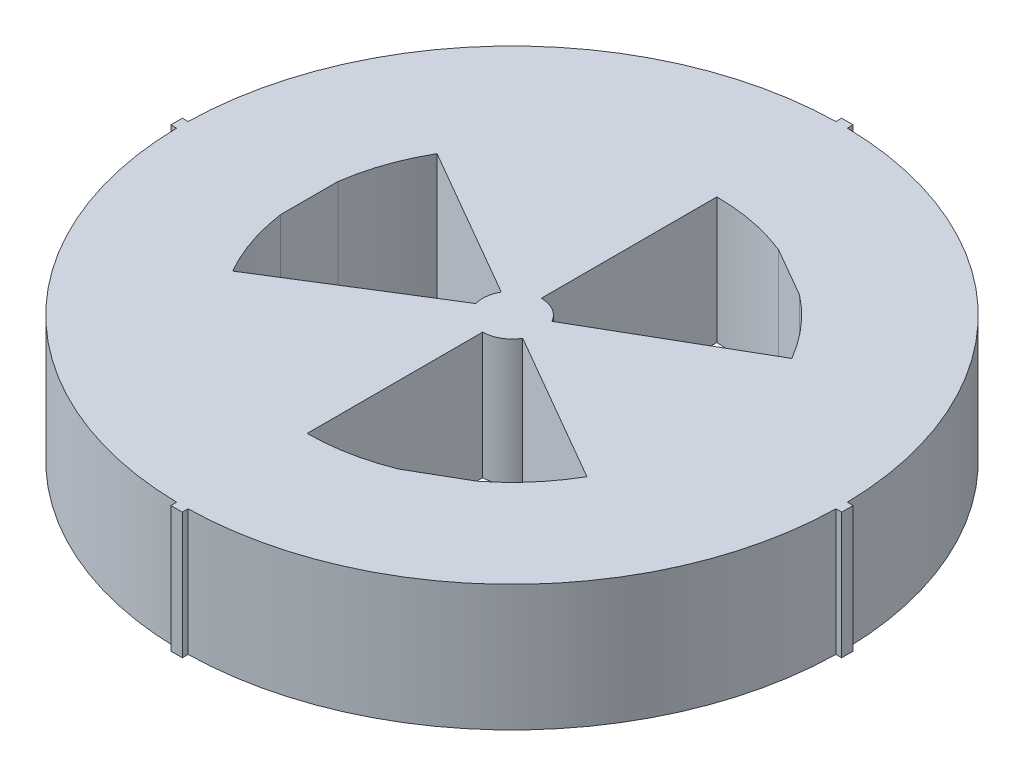
ISO-10303-21;
HEADER;
FILE_DESCRIPTION(('STEP AP214'),'2;1');
FILE_NAME('part.step','',(''),(''),'','','');
FILE_SCHEMA(('AUTOMOTIVE_DESIGN { 1 0 10303 214 1 1 1 1 }'));
ENDSEC;
DATA;
#1=APPLICATION_CONTEXT('core data for automotive mechanical design processes');
#2=APPLICATION_PROTOCOL_DEFINITION('international standard','automotive_design',2000,#1);
#3=PRODUCT_CONTEXT('',#1,'mechanical');
#4=PRODUCT('Part','Part','',(#3));
#5=PRODUCT_RELATED_PRODUCT_CATEGORY('part','',(#4));
#6=PRODUCT_DEFINITION_FORMATION('','',#4);
#7=PRODUCT_DEFINITION_CONTEXT('part definition',#1,'design');
#8=PRODUCT_DEFINITION('design','',#6,#7);
#9=PRODUCT_DEFINITION_SHAPE('','',#8);
#10=(LENGTH_UNIT() NAMED_UNIT(*) SI_UNIT(.MILLI.,.METRE.));
#11=(NAMED_UNIT(*) PLANE_ANGLE_UNIT() SI_UNIT($,.RADIAN.));
#12=(NAMED_UNIT(*) SI_UNIT($,.STERADIAN.) SOLID_ANGLE_UNIT());
#13=UNCERTAINTY_MEASURE_WITH_UNIT(LENGTH_MEASURE(1.E-05),#10,'distance_accuracy_value','');
#14=(GEOMETRIC_REPRESENTATION_CONTEXT(3) GLOBAL_UNCERTAINTY_ASSIGNED_CONTEXT((#13)) GLOBAL_UNIT_ASSIGNED_CONTEXT((#10,
#11,#12)) REPRESENTATION_CONTEXT('',''));
#15=CARTESIAN_POINT('',(0.,0.,0.));
#16=DIRECTION('',(0.,0.,1.));
#17=DIRECTION('',(1.,0.,0.));
#18=AXIS2_PLACEMENT_3D('',#15,#16,#17);
#19=CARTESIAN_POINT('',(0.,11.,0.));
#20=DIRECTION('',(0.,-1.,0.));
#21=DIRECTION('',(0.,0.,-1.));
#22=AXIS2_PLACEMENT_3D('',#19,#20,#21);
#23=PLANE('',#22);
#24=CARTESIAN_POINT('',(0.,11.,0.));
#25=DIRECTION('',(0.,-1.,0.));
#26=DIRECTION('',(0.,0.,-1.));
#27=AXIS2_PLACEMENT_3D('',#24,#25,#26);
#28=CIRCLE('',#27,2.55332923776841);
#29=CARTESIAN_POINT('',(2.21124798413299,11.,1.27666461888423));
#30=VERTEX_POINT('',#29);
#31=CARTESIAN_POINT('',(0.,11.,2.55332923776841));
#32=VERTEX_POINT('',#31);
#33=EDGE_CURVE('E292',#30,#32,#28,.T.);
#34=ORIENTED_EDGE('',*,*,#33,.F.);
#35=DIRECTION('',(0.866025403784433,0.,0.50000000000001));
#36=VECTOR('',#35,1.);
#37=CARTESIAN_POINT('',(0.,11.,0.));
#38=LINE('',#37,#36);
#39=CARTESIAN_POINT('',(15.4681544387612,11.,8.93054312908572));
#40=VERTEX_POINT('',#39);
#41=EDGE_CURVE('E303',#30,#40,#38,.T.);
#42=ORIENTED_EDGE('',*,*,#41,.T.);
#43=CARTESIAN_POINT('',(0.,11.,0.));
#44=DIRECTION('',(0.,-1.,0.));
#45=DIRECTION('',(0.,0.,-1.));
#46=AXIS2_PLACEMENT_3D('',#43,#44,#45);
#47=CIRCLE('',#46,17.8610862581711);
#48=CARTESIAN_POINT('',(11.008336836107,11.,14.0653802801289));
#49=VERTEX_POINT('',#48);
#50=EDGE_CURVE('E91',#40,#49,#47,.T.);
#51=ORIENTED_EDGE('',*,*,#50,.T.);
#52=DIRECTION('',(-0.866025403784442,0.,0.499999999999995));
#53=VECTOR('',#52,1.);
#54=CARTESIAN_POINT('',(8.84257252726679,11.,15.315784886839));
#55=LINE('',#54,#53);
#56=CARTESIAN_POINT('',(6.67680821842659,11.,16.5661894935492));
#57=VERTEX_POINT('',#56);
#58=EDGE_CURVE('E318',#49,#57,#55,.T.);
#59=ORIENTED_EDGE('',*,*,#58,.T.);
#60=CARTESIAN_POINT('',(0.,11.,17.8610862581711));
#61=VERTEX_POINT('',#60);
#62=EDGE_CURVE('E319',#57,#61,#47,.T.);
#63=ORIENTED_EDGE('',*,*,#62,.T.);
#64=DIRECTION('',(0.,0.,-1.));
#65=VECTOR('',#64,1.);
#66=CARTESIAN_POINT('',(0.,11.,0.));
#67=LINE('',#66,#65);
#68=EDGE_CURVE('E300',#61,#32,#67,.T.);
#69=ORIENTED_EDGE('',*,*,#68,.T.);
#70=EDGE_LOOP('',(#34,#42,#51,#59,#63,#69));
#71=FACE_BOUND('',#70,.T.);
#72=CARTESIAN_POINT('',(0.,11.,0.));
#73=DIRECTION('',(0.,-1.,0.));
#74=DIRECTION('',(0.,0.,-1.));
#75=AXIS2_PLACEMENT_3D('',#72,#73,#74);
#76=CIRCLE('',#75,28.75);
#77=CARTESIAN_POINT('',(0.500000000006432,11.,-28.7456518451051));
#78=VERTEX_POINT('',#77);
#79=CARTESIAN_POINT('',(28.7456518451053,11.,-0.499999999996743));
#80=VERTEX_POINT('',#79);
#81=EDGE_CURVE('E417',#78,#80,#76,.T.);
#82=ORIENTED_EDGE('',*,*,#81,.F.);
#83=DIRECTION('',(0.,0.,1.));
#84=VECTOR('',#83,1.);
#85=CARTESIAN_POINT('',(0.500000000006433,11.,-29.2499999999999));
#86=LINE('',#85,#84);
#87=CARTESIAN_POINT('',(0.500000000006433,11.,-29.2499999999999));
#88=VERTEX_POINT('',#87);
#89=EDGE_CURVE('E513',#88,#78,#86,.T.);
#90=ORIENTED_EDGE('',*,*,#89,.F.);
#91=DIRECTION('',(1.,0.,0.));
#92=VECTOR('',#91,1.);
#93=CARTESIAN_POINT('',(-0.499999999993567,11.,-29.2499999999999));
#94=LINE('',#93,#92);
#95=CARTESIAN_POINT('',(-0.499999999993567,11.,-29.2499999999999));
#96=VERTEX_POINT('',#95);
#97=EDGE_CURVE('E510',#96,#88,#94,.T.);
#98=ORIENTED_EDGE('',*,*,#97,.F.);
#99=DIRECTION('',(0.,0.,-1.));
#100=VECTOR('',#99,1.);
#101=CARTESIAN_POINT('',(-0.499999999993575,11.,-28.7456518451053));
#102=LINE('',#101,#100);
#103=CARTESIAN_POINT('',(-0.499999999993575,11.,-28.7456518451053));
#104=VERTEX_POINT('',#103);
#105=EDGE_CURVE('E507',#104,#96,#102,.T.);
#106=ORIENTED_EDGE('',*,*,#105,.F.);
#107=CARTESIAN_POINT('',(0.,11.,0.));
#108=DIRECTION('',(0.,-1.,0.));
#109=DIRECTION('',(0.,0.,-1.));
#110=AXIS2_PLACEMENT_3D('',#107,#108,#109);
#111=CIRCLE('',#110,28.75);
#112=CARTESIAN_POINT('',(-28.7456518451052,11.,-0.50000000000319));
#113=VERTEX_POINT('',#112);
#114=EDGE_CURVE('E504',#113,#104,#111,.T.);
#115=ORIENTED_EDGE('',*,*,#114,.F.);
#116=DIRECTION('',(1.,0.,0.));
#117=VECTOR('',#116,1.);
#118=CARTESIAN_POINT('',(-29.2499999999967,11.,-0.500000000003182));
#119=LINE('',#118,#117);
#120=CARTESIAN_POINT('',(-29.2499999999967,11.,-0.500000000003182));
#121=VERTEX_POINT('',#120);
#122=EDGE_CURVE('E501',#121,#113,#119,.T.);
#123=ORIENTED_EDGE('',*,*,#122,.F.);
#124=DIRECTION('',(0.,0.,-1.));
#125=VECTOR('',#124,1.);
#126=CARTESIAN_POINT('',(-29.2499999999967,11.,0.499999999996818));
#127=LINE('',#126,#125);
#128=CARTESIAN_POINT('',(-29.2499999999967,11.,0.499999999996818));
#129=VERTEX_POINT('',#128);
#130=EDGE_CURVE('E498',#129,#121,#127,.T.);
#131=ORIENTED_EDGE('',*,*,#130,.F.);
#132=DIRECTION('',(-1.,0.,0.));
#133=VECTOR('',#132,1.);
#134=CARTESIAN_POINT('',(-28.7456518451053,11.,0.499999999996816));
#135=LINE('',#134,#133);
#136=CARTESIAN_POINT('',(-28.7456518451053,11.,0.499999999996816));
#137=VERTEX_POINT('',#136);
#138=EDGE_CURVE('E495',#137,#129,#135,.T.);
#139=ORIENTED_EDGE('',*,*,#138,.F.);
#140=CARTESIAN_POINT('',(0.,11.,0.));
#141=DIRECTION('',(0.,-1.,0.));
#142=DIRECTION('',(0.,0.,-1.));
#143=AXIS2_PLACEMENT_3D('',#140,#141,#142);
#144=CIRCLE('',#143,28.75);
#145=CARTESIAN_POINT('',(-0.499999999999987,11.,28.7456518451052));
#146=VERTEX_POINT('',#145);
#147=EDGE_CURVE('E492',#146,#137,#144,.T.);
#148=ORIENTED_EDGE('',*,*,#147,.F.);
#149=DIRECTION('',(0.,0.,-1.));
#150=VECTOR('',#149,1.);
#151=CARTESIAN_POINT('',(-0.499999999999999,11.,29.25));
#152=LINE('',#151,#150);
#153=CARTESIAN_POINT('',(-0.499999999999999,11.,29.25));
#154=VERTEX_POINT('',#153);
#155=EDGE_CURVE('E489',#154,#146,#152,.T.);
#156=ORIENTED_EDGE('',*,*,#155,.F.);
#157=DIRECTION('',(-1.,0.,0.));
#158=VECTOR('',#157,1.);
#159=CARTESIAN_POINT('',(0.500000000000001,11.,29.25));
#160=LINE('',#159,#158);
#161=CARTESIAN_POINT('',(0.500000000000001,11.,29.25));
#162=VERTEX_POINT('',#161);
#163=EDGE_CURVE('E486',#162,#154,#160,.T.);
#164=ORIENTED_EDGE('',*,*,#163,.F.);
#165=DIRECTION('',(0.,0.,1.));
#166=VECTOR('',#165,1.);
#167=CARTESIAN_POINT('',(0.499999999999999,11.,28.7456518451052));
#168=LINE('',#167,#166);
#169=CARTESIAN_POINT('',(0.499999999999999,11.,28.7456518451052));
#170=VERTEX_POINT('',#169);
#171=EDGE_CURVE('E483',#170,#162,#168,.T.);
#172=ORIENTED_EDGE('',*,*,#171,.F.);
#173=CARTESIAN_POINT('',(0.,11.,0.));
#174=DIRECTION('',(0.,-1.,0.));
#175=DIRECTION('',(0.,0.,-1.));
#176=AXIS2_PLACEMENT_3D('',#173,#174,#175);
#177=CIRCLE('',#176,28.75);
#178=CARTESIAN_POINT('',(28.7456518451051,11.,0.500000000003257));
#179=VERTEX_POINT('',#178);
#180=EDGE_CURVE('E480',#179,#170,#177,.T.);
#181=ORIENTED_EDGE('',*,*,#180,.F.);
#182=DIRECTION('',(-1.,0.,0.));
#183=VECTOR('',#182,1.);
#184=CARTESIAN_POINT('',(29.2500000000032,11.,0.500000000003255));
#185=LINE('',#184,#183);
#186=CARTESIAN_POINT('',(29.2500000000032,11.,0.500000000003255));
#187=VERTEX_POINT('',#186);
#188=EDGE_CURVE('E477',#187,#179,#185,.T.);
#189=ORIENTED_EDGE('',*,*,#188,.F.);
#190=DIRECTION('',(0.,0.,1.));
#191=VECTOR('',#190,1.);
#192=CARTESIAN_POINT('',(29.2500000000032,11.,-0.499999999996745));
#193=LINE('',#192,#191);
#194=CARTESIAN_POINT('',(29.2500000000032,11.,-0.499999999996745));
#195=VERTEX_POINT('',#194);
#196=EDGE_CURVE('E474',#195,#187,#193,.T.);
#197=ORIENTED_EDGE('',*,*,#196,.F.);
#198=DIRECTION('',(1.,0.,0.));
#199=VECTOR('',#198,1.);
#200=CARTESIAN_POINT('',(28.7456518451053,11.,-0.499999999996743));
#201=LINE('',#200,#199);
#202=EDGE_CURVE('E471',#80,#195,#201,.T.);
#203=ORIENTED_EDGE('',*,*,#202,.F.);
#204=EDGE_LOOP('',(#82,#90,#98,#106,#115,#123,#131,#139,#148,#156,#164,#172,#181,#189,#197,#203));
#205=FACE_BOUND('',#204,.T.);
#206=CARTESIAN_POINT('',(0.,11.,0.));
#207=DIRECTION('',(0.,-1.,0.));
#208=DIRECTION('',(0.,0.,-1.));
#209=AXIS2_PLACEMENT_3D('',#206,#207,#208);
#210=CIRCLE('',#209,2.55332923776841);
#211=CARTESIAN_POINT('',(0.,11.,-2.55332923776841));
#212=VERTEX_POINT('',#211);
#213=CARTESIAN_POINT('',(2.21124798413301,11.,-1.27666461888418));
#214=VERTEX_POINT('',#213);
#215=EDGE_CURVE('E384',#212,#214,#210,.T.);
#216=ORIENTED_EDGE('',*,*,#215,.F.);
#217=DIRECTION('',(0.,0.,-1.));
#218=VECTOR('',#217,1.);
#219=CARTESIAN_POINT('',(0.,11.,0.));
#220=LINE('',#219,#218);
#221=CARTESIAN_POINT('',(1.33661352191384E-13,11.,-17.8610862581711));
#222=VERTEX_POINT('',#221);
#223=EDGE_CURVE('E386',#212,#222,#220,.T.);
#224=ORIENTED_EDGE('',*,*,#223,.T.);
#225=CARTESIAN_POINT('',(0.,11.,0.));
#226=DIRECTION('',(0.,-1.,0.));
#227=DIRECTION('',(0.,0.,-1.));
#228=AXIS2_PLACEMENT_3D('',#225,#226,#227);
#229=CIRCLE('',#228,17.8610862581711);
#230=CARTESIAN_POINT('',(6.67680821842634,11.,-16.5661894935493));
#231=VERTEX_POINT('',#230);
#232=EDGE_CURVE('E390',#222,#231,#229,.T.);
#233=ORIENTED_EDGE('',*,*,#232,.T.);
#234=DIRECTION('',(0.866025403784435,0.,0.500000000000007));
#235=VECTOR('',#234,1.);
#236=CARTESIAN_POINT('',(8.84257252726696,11.,-15.3157848868388));
#237=LINE('',#236,#235);
#238=CARTESIAN_POINT('',(11.0083368361076,11.,-14.0653802801284));
#239=VERTEX_POINT('',#238);
#240=EDGE_CURVE('E393',#231,#239,#237,.T.);
#241=ORIENTED_EDGE('',*,*,#240,.T.);
#242=CARTESIAN_POINT('',(15.4681544387614,11.,-8.9305431290854));
#243=VERTEX_POINT('',#242);
#244=EDGE_CURVE('E394',#239,#243,#229,.T.);
#245=ORIENTED_EDGE('',*,*,#244,.T.);
#246=DIRECTION('',(0.866025403784443,0.,-0.499999999999992));
#247=VECTOR('',#246,1.);
#248=CARTESIAN_POINT('',(0.,11.,0.));
#249=LINE('',#248,#247);
#250=EDGE_CURVE('E397',#214,#243,#249,.T.);
#251=ORIENTED_EDGE('',*,*,#250,.F.);
#252=EDGE_LOOP('',(#216,#224,#233,#241,#245,#251));
#253=FACE_BOUND('',#252,.T.);
#254=CARTESIAN_POINT('',(0.,11.,0.));
#255=DIRECTION('',(0.,-1.,0.));
#256=DIRECTION('',(0.,0.,-1.));
#257=AXIS2_PLACEMENT_3D('',#254,#255,#256);
#258=CIRCLE('',#257,2.55332923776841);
#259=CARTESIAN_POINT('',(-2.45604148684945,11.,0.69810487128896));
#260=VERTEX_POINT('',#259);
#261=CARTESIAN_POINT('',(-2.211247984133,11.,-1.27666461888422));
#262=VERTEX_POINT('',#261);
#263=EDGE_CURVE('E343',#260,#262,#258,.T.);
#264=ORIENTED_EDGE('',*,*,#263,.F.);
#265=DIRECTION('',(-0.848142730469945,0.,0.52976778757394));
#266=VECTOR('',#265,1.);
#267=CARTESIAN_POINT('',(-0.375626071596031,11.,-0.601366352337329));
#268=LINE('',#267,#266);
#269=CARTESIAN_POINT('',(-15.5124354862973,11.,8.85340316518414));
#270=VERTEX_POINT('',#269);
#271=EDGE_CURVE('E345',#260,#270,#268,.T.);
#272=ORIENTED_EDGE('',*,*,#271,.T.);
#273=CARTESIAN_POINT('',(0.,11.,0.));
#274=DIRECTION('',(0.,-1.,0.));
#275=DIRECTION('',(0.,0.,-1.));
#276=AXIS2_PLACEMENT_3D('',#273,#274,#275);
#277=CIRCLE('',#276,17.8610862581711);
#278=CARTESIAN_POINT('',(-17.6851450545337,11.,2.50080921342079));
#279=VERTEX_POINT('',#278);
#280=EDGE_CURVE('E83',#270,#279,#277,.T.);
#281=ORIENTED_EDGE('',*,*,#280,.T.);
#282=DIRECTION('',(0.,0.,-1.));
#283=VECTOR('',#282,1.);
#284=CARTESIAN_POINT('',(-17.6851450545337,11.,0.));
#285=LINE('',#284,#283);
#286=CARTESIAN_POINT('',(-17.6851450545337,11.,-2.50080921342091));
#287=VERTEX_POINT('',#286);
#288=EDGE_CURVE('E350',#279,#287,#285,.T.);
#289=ORIENTED_EDGE('',*,*,#288,.T.);
#290=CARTESIAN_POINT('',(-15.4681544387613,11.,-8.93054312908561));
#291=VERTEX_POINT('',#290);
#292=EDGE_CURVE('E351',#287,#291,#277,.T.);
#293=ORIENTED_EDGE('',*,*,#292,.T.);
#294=DIRECTION('',(-0.866025403784436,0.,-0.500000000000004));
#295=VECTOR('',#294,1.);
#296=CARTESIAN_POINT('',(0.,11.,0.));
#297=LINE('',#296,#295);
#298=EDGE_CURVE('E354',#262,#291,#297,.T.);
#299=ORIENTED_EDGE('',*,*,#298,.F.);
#300=EDGE_LOOP('',(#264,#272,#281,#289,#293,#299));
#301=FACE_BOUND('',#300,.T.);
#302=ADVANCED_FACE('F66',(#71,#205,#253,#301),#23,.F.);
#303=CARTESIAN_POINT('',(0.,0.,0.));
#304=DIRECTION('',(0.,1.,0.));
#305=DIRECTION('',(0.,0.,1.));
#306=AXIS2_PLACEMENT_3D('',#303,#304,#305);
#307=PLANE('',#306);
#308=CARTESIAN_POINT('',(0.,0.,0.));
#309=DIRECTION('',(0.,-1.,0.));
#310=DIRECTION('',(0.,0.,-1.));
#311=AXIS2_PLACEMENT_3D('',#308,#309,#310);
#312=CIRCLE('',#311,2.55332923776841);
#313=CARTESIAN_POINT('',(2.21124798413299,0.,1.27666461888423));
#314=VERTEX_POINT('',#313);
#315=CARTESIAN_POINT('',(0.,0.,2.55332923776841));
#316=VERTEX_POINT('',#315);
#317=EDGE_CURVE('E295',#314,#316,#312,.T.);
#318=ORIENTED_EDGE('',*,*,#317,.T.);
#319=DIRECTION('',(0.,0.,-1.));
#320=VECTOR('',#319,1.);
#321=CARTESIAN_POINT('',(0.,0.,0.));
#322=LINE('',#321,#320);
#323=CARTESIAN_POINT('',(0.,0.,17.8610862581711));
#324=VERTEX_POINT('',#323);
#325=EDGE_CURVE('E311',#324,#316,#322,.T.);
#326=ORIENTED_EDGE('',*,*,#325,.F.);
#327=CARTESIAN_POINT('',(0.,0.,0.));
#328=DIRECTION('',(0.,-1.,0.));
#329=DIRECTION('',(0.,0.,-1.));
#330=AXIS2_PLACEMENT_3D('',#327,#328,#329);
#331=CIRCLE('',#330,17.8610862581711);
#332=CARTESIAN_POINT('',(6.67680821842659,0.,16.5661894935492));
#333=VERTEX_POINT('',#332);
#334=EDGE_CURVE('E314',#333,#324,#331,.T.);
#335=ORIENTED_EDGE('',*,*,#334,.F.);
#336=DIRECTION('',(-0.866025403784442,0.,0.499999999999995));
#337=VECTOR('',#336,1.);
#338=CARTESIAN_POINT('',(8.84257252726679,0.,15.315784886839));
#339=LINE('',#338,#337);
#340=CARTESIAN_POINT('',(11.008336836107,0.,14.0653802801289));
#341=VERTEX_POINT('',#340);
#342=EDGE_CURVE('E330',#341,#333,#339,.T.);
#343=ORIENTED_EDGE('',*,*,#342,.F.);
#344=CARTESIAN_POINT('',(15.4681544387612,0.,8.93054312908572));
#345=VERTEX_POINT('',#344);
#346=EDGE_CURVE('E327',#345,#341,#331,.T.);
#347=ORIENTED_EDGE('',*,*,#346,.F.);
#348=DIRECTION('',(0.866025403784433,0.,0.50000000000001));
#349=VECTOR('',#348,1.);
#350=CARTESIAN_POINT('',(0.,0.,0.));
#351=LINE('',#350,#349);
#352=EDGE_CURVE('E324',#314,#345,#351,.T.);
#353=ORIENTED_EDGE('',*,*,#352,.F.);
#354=EDGE_LOOP('',(#318,#326,#335,#343,#347,#353));
#355=FACE_BOUND('',#354,.T.);
#356=DIRECTION('',(-1.,0.,0.));
#357=VECTOR('',#356,1.);
#358=CARTESIAN_POINT('',(28.7456518451053,0.,-0.499999999996743));
#359=LINE('',#358,#357);
#360=CARTESIAN_POINT('',(29.2500000000032,0.,-0.499999999996745));
#361=VERTEX_POINT('',#360);
#362=CARTESIAN_POINT('',(28.7456518451053,0.,-0.499999999996743));
#363=VERTEX_POINT('',#362);
#364=EDGE_CURVE('E75',#361,#363,#359,.T.);
#365=ORIENTED_EDGE('',*,*,#364,.F.);
#366=DIRECTION('',(0.,0.,-1.));
#367=VECTOR('',#366,1.);
#368=CARTESIAN_POINT('',(29.2500000000032,0.,-0.499999999996745));
#369=LINE('',#368,#367);
#370=CARTESIAN_POINT('',(29.2500000000032,0.,0.500000000003255));
#371=VERTEX_POINT('',#370);
#372=EDGE_CURVE('E464',#371,#361,#369,.T.);
#373=ORIENTED_EDGE('',*,*,#372,.F.);
#374=DIRECTION('',(1.,0.,0.));
#375=VECTOR('',#374,1.);
#376=CARTESIAN_POINT('',(29.2500000000032,0.,0.500000000003255));
#377=LINE('',#376,#375);
#378=CARTESIAN_POINT('',(28.7456518451052,0.,0.500000000003257));
#379=VERTEX_POINT('',#378);
#380=EDGE_CURVE('E461',#379,#371,#377,.T.);
#381=ORIENTED_EDGE('',*,*,#380,.F.);
#382=CARTESIAN_POINT('',(0.,0.,0.));
#383=DIRECTION('',(0.,1.,0.));
#384=DIRECTION('',(0.,0.,1.));
#385=AXIS2_PLACEMENT_3D('',#382,#383,#384);
#386=CIRCLE('',#385,28.75);
#387=CARTESIAN_POINT('',(0.499999999999999,0.,28.7456518451052));
#388=VERTEX_POINT('',#387);
#389=EDGE_CURVE('E458',#388,#379,#386,.T.);
#390=ORIENTED_EDGE('',*,*,#389,.F.);
#391=DIRECTION('',(0.,0.,-1.));
#392=VECTOR('',#391,1.);
#393=CARTESIAN_POINT('',(0.499999999999999,0.,28.7456518451052));
#394=LINE('',#393,#392);
#395=CARTESIAN_POINT('',(0.500000000000001,0.,29.25));
#396=VERTEX_POINT('',#395);
#397=EDGE_CURVE('E455',#396,#388,#394,.T.);
#398=ORIENTED_EDGE('',*,*,#397,.F.);
#399=DIRECTION('',(1.,0.,0.));
#400=VECTOR('',#399,1.);
#401=CARTESIAN_POINT('',(0.500000000000001,0.,29.25));
#402=LINE('',#401,#400);
#403=CARTESIAN_POINT('',(-0.499999999999999,0.,29.25));
#404=VERTEX_POINT('',#403);
#405=EDGE_CURVE('E452',#404,#396,#402,.T.);
#406=ORIENTED_EDGE('',*,*,#405,.F.);
#407=DIRECTION('',(0.,0.,1.));
#408=VECTOR('',#407,1.);
#409=CARTESIAN_POINT('',(-0.499999999999999,0.,29.25));
#410=LINE('',#409,#408);
#411=CARTESIAN_POINT('',(-0.499999999999987,0.,28.7456518451052));
#412=VERTEX_POINT('',#411);
#413=EDGE_CURVE('E449',#412,#404,#410,.T.);
#414=ORIENTED_EDGE('',*,*,#413,.F.);
#415=CARTESIAN_POINT('',(0.,0.,0.));
#416=DIRECTION('',(0.,1.,0.));
#417=DIRECTION('',(0.,0.,1.));
#418=AXIS2_PLACEMENT_3D('',#415,#416,#417);
#419=CIRCLE('',#418,28.75);
#420=CARTESIAN_POINT('',(-28.7456518451053,0.,0.499999999996816));
#421=VERTEX_POINT('',#420);
#422=EDGE_CURVE('E446',#421,#412,#419,.T.);
#423=ORIENTED_EDGE('',*,*,#422,.F.);
#424=DIRECTION('',(1.,0.,0.));
#425=VECTOR('',#424,1.);
#426=CARTESIAN_POINT('',(-28.7456518451053,0.,0.499999999996816));
#427=LINE('',#426,#425);
#428=CARTESIAN_POINT('',(-29.2499999999967,0.,0.499999999996818));
#429=VERTEX_POINT('',#428);
#430=EDGE_CURVE('E443',#429,#421,#427,.T.);
#431=ORIENTED_EDGE('',*,*,#430,.F.);
#432=DIRECTION('',(0.,0.,1.));
#433=VECTOR('',#432,1.);
#434=CARTESIAN_POINT('',(-29.2499999999967,0.,0.499999999996818));
#435=LINE('',#434,#433);
#436=CARTESIAN_POINT('',(-29.2499999999967,0.,-0.500000000003182));
#437=VERTEX_POINT('',#436);
#438=EDGE_CURVE('E440',#437,#429,#435,.T.);
#439=ORIENTED_EDGE('',*,*,#438,.F.);
#440=DIRECTION('',(-1.,0.,0.));
#441=VECTOR('',#440,1.);
#442=CARTESIAN_POINT('',(-29.2499999999967,0.,-0.500000000003182));
#443=LINE('',#442,#441);
#444=CARTESIAN_POINT('',(-28.7456518451052,0.,-0.50000000000319));
#445=VERTEX_POINT('',#444);
#446=EDGE_CURVE('E437',#445,#437,#443,.T.);
#447=ORIENTED_EDGE('',*,*,#446,.F.);
#448=CARTESIAN_POINT('',(0.,0.,0.));
#449=DIRECTION('',(0.,1.,0.));
#450=DIRECTION('',(0.,0.,1.));
#451=AXIS2_PLACEMENT_3D('',#448,#449,#450);
#452=CIRCLE('',#451,28.75);
#453=CARTESIAN_POINT('',(-0.499999999993575,0.,-28.7456518451053));
#454=VERTEX_POINT('',#453);
#455=EDGE_CURVE('E434',#454,#445,#452,.T.);
#456=ORIENTED_EDGE('',*,*,#455,.F.);
#457=DIRECTION('',(0.,0.,1.));
#458=VECTOR('',#457,1.);
#459=CARTESIAN_POINT('',(-0.499999999993575,0.,-28.7456518451053));
#460=LINE('',#459,#458);
#461=CARTESIAN_POINT('',(-0.499999999993567,0.,-29.2499999999999));
#462=VERTEX_POINT('',#461);
#463=EDGE_CURVE('E431',#462,#454,#460,.T.);
#464=ORIENTED_EDGE('',*,*,#463,.F.);
#465=DIRECTION('',(-1.,0.,0.));
#466=VECTOR('',#465,1.);
#467=CARTESIAN_POINT('',(-0.499999999993567,0.,-29.2499999999999));
#468=LINE('',#467,#466);
#469=CARTESIAN_POINT('',(0.500000000006433,0.,-29.2499999999999));
#470=VERTEX_POINT('',#469);
#471=EDGE_CURVE('E428',#470,#462,#468,.T.);
#472=ORIENTED_EDGE('',*,*,#471,.F.);
#473=DIRECTION('',(0.,0.,-1.));
#474=VECTOR('',#473,1.);
#475=CARTESIAN_POINT('',(0.500000000006433,0.,-29.2499999999999));
#476=LINE('',#475,#474);
#477=CARTESIAN_POINT('',(0.500000000006432,0.,-28.7456518451051));
#478=VERTEX_POINT('',#477);
#479=EDGE_CURVE('E70',#478,#470,#476,.T.);
#480=ORIENTED_EDGE('',*,*,#479,.F.);
#481=CARTESIAN_POINT('',(0.,0.,0.));
#482=DIRECTION('',(0.,1.,0.));
#483=DIRECTION('',(0.,0.,1.));
#484=AXIS2_PLACEMENT_3D('',#481,#482,#483);
#485=CIRCLE('',#484,28.75);
#486=EDGE_CURVE('E13',#363,#478,#485,.T.);
#487=ORIENTED_EDGE('',*,*,#486,.F.);
#488=EDGE_LOOP('',(#365,#373,#381,#390,#398,#406,#414,#423,#431,#439,#447,#456,#464,#472,#480,#487));
#489=FACE_BOUND('',#488,.T.);
#490=CARTESIAN_POINT('',(0.,0.,0.));
#491=DIRECTION('',(0.,-1.,0.));
#492=DIRECTION('',(0.,0.,-1.));
#493=AXIS2_PLACEMENT_3D('',#490,#491,#492);
#494=CIRCLE('',#493,2.55332923776841);
#495=CARTESIAN_POINT('',(0.,0.,-2.55332923776841));
#496=VERTEX_POINT('',#495);
#497=CARTESIAN_POINT('',(2.21124798413301,0.,-1.27666461888418));
#498=VERTEX_POINT('',#497);
#499=EDGE_CURVE('E335',#496,#498,#494,.T.);
#500=ORIENTED_EDGE('',*,*,#499,.T.);
#501=DIRECTION('',(0.866025403784443,0.,-0.499999999999992));
#502=VECTOR('',#501,1.);
#503=CARTESIAN_POINT('',(0.,0.,0.));
#504=LINE('',#503,#502);
#505=CARTESIAN_POINT('',(15.4681544387614,0.,-8.9305431290854));
#506=VERTEX_POINT('',#505);
#507=EDGE_CURVE('E387',#498,#506,#504,.T.);
#508=ORIENTED_EDGE('',*,*,#507,.T.);
#509=CARTESIAN_POINT('',(0.,0.,0.));
#510=DIRECTION('',(0.,-1.,0.));
#511=DIRECTION('',(0.,0.,-1.));
#512=AXIS2_PLACEMENT_3D('',#509,#510,#511);
#513=CIRCLE('',#512,17.8610862581711);
#514=CARTESIAN_POINT('',(11.0083368361076,0.,-14.0653802801284));
#515=VERTEX_POINT('',#514);
#516=EDGE_CURVE('E409',#515,#506,#513,.T.);
#517=ORIENTED_EDGE('',*,*,#516,.F.);
#518=DIRECTION('',(0.866025403784435,0.,0.500000000000007));
#519=VECTOR('',#518,1.);
#520=CARTESIAN_POINT('',(8.84257252726696,0.,-15.3157848868388));
#521=LINE('',#520,#519);
#522=CARTESIAN_POINT('',(6.67680821842634,0.,-16.5661894935493));
#523=VERTEX_POINT('',#522);
#524=EDGE_CURVE('E408',#523,#515,#521,.T.);
#525=ORIENTED_EDGE('',*,*,#524,.F.);
#526=CARTESIAN_POINT('',(1.33661352191384E-13,0.,-17.8610862581711));
#527=VERTEX_POINT('',#526);
#528=EDGE_CURVE('E405',#527,#523,#513,.T.);
#529=ORIENTED_EDGE('',*,*,#528,.F.);
#530=DIRECTION('',(0.,0.,-1.));
#531=VECTOR('',#530,1.);
#532=CARTESIAN_POINT('',(0.,0.,0.));
#533=LINE('',#532,#531);
#534=EDGE_CURVE('E402',#496,#527,#533,.T.);
#535=ORIENTED_EDGE('',*,*,#534,.F.);
#536=EDGE_LOOP('',(#500,#508,#517,#525,#529,#535));
#537=FACE_BOUND('',#536,.T.);
#538=CARTESIAN_POINT('',(0.,0.,0.));
#539=DIRECTION('',(0.,-1.,0.));
#540=DIRECTION('',(0.,0.,-1.));
#541=AXIS2_PLACEMENT_3D('',#538,#539,#540);
#542=CIRCLE('',#541,2.55332923776841);
#543=CARTESIAN_POINT('',(-2.45604148684945,0.,0.69810487128896));
#544=VERTEX_POINT('',#543);
#545=CARTESIAN_POINT('',(-2.211247984133,0.,-1.27666461888422));
#546=VERTEX_POINT('',#545);
#547=EDGE_CURVE('E357',#544,#546,#542,.T.);
#548=ORIENTED_EDGE('',*,*,#547,.T.);
#549=DIRECTION('',(-0.866025403784436,0.,-0.500000000000004));
#550=VECTOR('',#549,1.);
#551=CARTESIAN_POINT('',(0.,0.,0.));
#552=LINE('',#551,#550);
#553=CARTESIAN_POINT('',(-15.4681544387613,0.,-8.93054312908561));
#554=VERTEX_POINT('',#553);
#555=EDGE_CURVE('E346',#546,#554,#552,.T.);
#556=ORIENTED_EDGE('',*,*,#555,.T.);
#557=CARTESIAN_POINT('',(0.,0.,0.));
#558=DIRECTION('',(0.,-1.,0.));
#559=DIRECTION('',(0.,0.,-1.));
#560=AXIS2_PLACEMENT_3D('',#557,#558,#559);
#561=CIRCLE('',#560,17.8610862581711);
#562=CARTESIAN_POINT('',(-17.6851450545337,0.,-2.50080921342091));
#563=VERTEX_POINT('',#562);
#564=EDGE_CURVE('E367',#563,#554,#561,.T.);
#565=ORIENTED_EDGE('',*,*,#564,.F.);
#566=DIRECTION('',(0.,0.,-1.));
#567=VECTOR('',#566,1.);
#568=CARTESIAN_POINT('',(-17.6851450545337,0.,0.));
#569=LINE('',#568,#567);
#570=CARTESIAN_POINT('',(-17.6851450545337,0.,2.50080921342079));
#571=VERTEX_POINT('',#570);
#572=EDGE_CURVE('E366',#571,#563,#569,.T.);
#573=ORIENTED_EDGE('',*,*,#572,.F.);
#574=CARTESIAN_POINT('',(-15.5124354862973,0.,8.85340316518414));
#575=VERTEX_POINT('',#574);
#576=EDGE_CURVE('E363',#575,#571,#561,.T.);
#577=ORIENTED_EDGE('',*,*,#576,.F.);
#578=DIRECTION('',(-0.848142730469945,0.,0.52976778757394));
#579=VECTOR('',#578,1.);
#580=CARTESIAN_POINT('',(-0.375626071596031,0.,-0.601366352337329));
#581=LINE('',#580,#579);
#582=EDGE_CURVE('E360',#544,#575,#581,.T.);
#583=ORIENTED_EDGE('',*,*,#582,.F.);
#584=EDGE_LOOP('',(#548,#556,#565,#573,#577,#583));
#585=FACE_BOUND('',#584,.T.);
#586=ADVANCED_FACE('F555',(#355,#489,#537,#585),#307,.F.);
#587=CARTESIAN_POINT('',(0.500000000006433,-82.731493398826,-29.2499999999999));
#588=DIRECTION('',(-1.,0.,0.));
#589=DIRECTION('',(0.,0.,1.));
#590=AXIS2_PLACEMENT_3D('',#587,#588,#589);
#591=PLANE('',#590);
#592=DIRECTION('',(0.,1.,0.));
#593=VECTOR('',#592,1.);
#594=CARTESIAN_POINT('',(0.500000000006432,-82.731493398826,-28.7456518451051));
#595=LINE('',#594,#593);
#596=EDGE_CURVE('E516',#478,#78,#595,.T.);
#597=ORIENTED_EDGE('',*,*,#596,.F.);
#598=ORIENTED_EDGE('',*,*,#479,.T.);
#599=DIRECTION('',(0.,1.,0.));
#600=VECTOR('',#599,1.);
#601=CARTESIAN_POINT('',(0.500000000006433,-82.731493398826,-29.2499999999999));
#602=LINE('',#601,#600);
#603=EDGE_CURVE('E518',#470,#88,#602,.T.);
#604=ORIENTED_EDGE('',*,*,#603,.T.);
#605=ORIENTED_EDGE('',*,*,#89,.T.);
#606=EDGE_LOOP('',(#597,#598,#604,#605));
#607=FACE_BOUND('',#606,.T.);
#608=ADVANCED_FACE('F552',(#607),#591,.F.);
#609=CARTESIAN_POINT('',(-0.499999999993567,-82.731493398826,-29.2499999999999));
#610=DIRECTION('',(0.,0.,1.));
#611=DIRECTION('',(1.,0.,0.));
#612=AXIS2_PLACEMENT_3D('',#609,#610,#611);
#613=PLANE('',#612);
#614=ORIENTED_EDGE('',*,*,#603,.F.);
#615=ORIENTED_EDGE('',*,*,#471,.T.);
#616=DIRECTION('',(0.,1.,0.));
#617=VECTOR('',#616,1.);
#618=CARTESIAN_POINT('',(-0.499999999993567,-82.731493398826,-29.2499999999999));
#619=LINE('',#618,#617);
#620=EDGE_CURVE('E520',#462,#96,#619,.T.);
#621=ORIENTED_EDGE('',*,*,#620,.T.);
#622=ORIENTED_EDGE('',*,*,#97,.T.);
#623=EDGE_LOOP('',(#614,#615,#621,#622));
#624=FACE_BOUND('',#623,.T.);
#625=ADVANCED_FACE('F611',(#624),#613,.F.);
#626=CARTESIAN_POINT('',(-0.499999999993575,-82.731493398826,-28.7456518451053));
#627=DIRECTION('',(1.,0.,0.));
#628=DIRECTION('',(0.,0.,-1.));
#629=AXIS2_PLACEMENT_3D('',#626,#627,#628);
#630=PLANE('',#629);
#631=ORIENTED_EDGE('',*,*,#620,.F.);
#632=ORIENTED_EDGE('',*,*,#463,.T.);
#633=DIRECTION('',(0.,1.,0.));
#634=VECTOR('',#633,1.);
#635=CARTESIAN_POINT('',(-0.499999999993575,-82.731493398826,-28.7456518451053));
#636=LINE('',#635,#634);
#637=EDGE_CURVE('E522',#454,#104,#636,.T.);
#638=ORIENTED_EDGE('',*,*,#637,.T.);
#639=ORIENTED_EDGE('',*,*,#105,.T.);
#640=EDGE_LOOP('',(#631,#632,#638,#639));
#641=FACE_BOUND('',#640,.T.);
#642=ADVANCED_FACE('F608',(#641),#630,.F.);
#643=CARTESIAN_POINT('',(0.,-82.731493398826,0.));
#644=DIRECTION('',(0.,1.,0.));
#645=DIRECTION('',(0.,0.,1.));
#646=AXIS2_PLACEMENT_3D('',#643,#644,#645);
#647=CYLINDRICAL_SURFACE('',#646,28.75);
#648=ORIENTED_EDGE('',*,*,#637,.F.);
#649=ORIENTED_EDGE('',*,*,#455,.T.);
#650=DIRECTION('',(0.,1.,0.));
#651=VECTOR('',#650,1.);
#652=CARTESIAN_POINT('',(-28.7456518451052,-82.731493398826,-0.50000000000319));
#653=LINE('',#652,#651);
#654=EDGE_CURVE('E524',#445,#113,#653,.T.);
#655=ORIENTED_EDGE('',*,*,#654,.T.);
#656=ORIENTED_EDGE('',*,*,#114,.T.);
#657=EDGE_LOOP('',(#648,#649,#655,#656));
#658=FACE_BOUND('',#657,.T.);
#659=ADVANCED_FACE('F604',(#658),#647,.T.);
#660=CARTESIAN_POINT('',(-29.2499999999967,-82.731493398826,-0.500000000003182));
#661=DIRECTION('',(0.,0.,1.));
#662=DIRECTION('',(1.,0.,0.));
#663=AXIS2_PLACEMENT_3D('',#660,#661,#662);
#664=PLANE('',#663);
#665=ORIENTED_EDGE('',*,*,#654,.F.);
#666=ORIENTED_EDGE('',*,*,#446,.T.);
#667=DIRECTION('',(0.,1.,0.));
#668=VECTOR('',#667,1.);
#669=CARTESIAN_POINT('',(-29.2499999999967,-82.731493398826,-0.500000000003182));
#670=LINE('',#669,#668);
#671=EDGE_CURVE('E526',#437,#121,#670,.T.);
#672=ORIENTED_EDGE('',*,*,#671,.T.);
#673=ORIENTED_EDGE('',*,*,#122,.T.);
#674=EDGE_LOOP('',(#665,#666,#672,#673));
#675=FACE_BOUND('',#674,.T.);
#676=ADVANCED_FACE('F600',(#675),#664,.F.);
#677=CARTESIAN_POINT('',(-29.2499999999967,-82.731493398826,0.499999999996818));
#678=DIRECTION('',(1.,0.,0.));
#679=DIRECTION('',(0.,0.,-1.));
#680=AXIS2_PLACEMENT_3D('',#677,#678,#679);
#681=PLANE('',#680);
#682=ORIENTED_EDGE('',*,*,#671,.F.);
#683=ORIENTED_EDGE('',*,*,#438,.T.);
#684=DIRECTION('',(0.,1.,0.));
#685=VECTOR('',#684,1.);
#686=CARTESIAN_POINT('',(-29.2499999999967,-82.731493398826,0.499999999996818));
#687=LINE('',#686,#685);
#688=EDGE_CURVE('E528',#429,#129,#687,.T.);
#689=ORIENTED_EDGE('',*,*,#688,.T.);
#690=ORIENTED_EDGE('',*,*,#130,.T.);
#691=EDGE_LOOP('',(#682,#683,#689,#690));
#692=FACE_BOUND('',#691,.T.);
#693=ADVANCED_FACE('F596',(#692),#681,.F.);
#694=CARTESIAN_POINT('',(-28.7456518451053,-82.731493398826,0.499999999996816));
#695=DIRECTION('',(0.,0.,-1.));
#696=DIRECTION('',(-1.,0.,0.));
#697=AXIS2_PLACEMENT_3D('',#694,#695,#696);
#698=PLANE('',#697);
#699=ORIENTED_EDGE('',*,*,#688,.F.);
#700=ORIENTED_EDGE('',*,*,#430,.T.);
#701=DIRECTION('',(0.,1.,0.));
#702=VECTOR('',#701,1.);
#703=CARTESIAN_POINT('',(-28.7456518451053,-82.731493398826,0.499999999996816));
#704=LINE('',#703,#702);
#705=EDGE_CURVE('E530',#421,#137,#704,.T.);
#706=ORIENTED_EDGE('',*,*,#705,.T.);
#707=ORIENTED_EDGE('',*,*,#138,.T.);
#708=EDGE_LOOP('',(#699,#700,#706,#707));
#709=FACE_BOUND('',#708,.T.);
#710=ADVANCED_FACE('F592',(#709),#698,.F.);
#711=CARTESIAN_POINT('',(0.,-82.731493398826,0.));
#712=DIRECTION('',(0.,1.,0.));
#713=DIRECTION('',(0.,0.,1.));
#714=AXIS2_PLACEMENT_3D('',#711,#712,#713);
#715=CYLINDRICAL_SURFACE('',#714,28.75);
#716=ORIENTED_EDGE('',*,*,#705,.F.);
#717=ORIENTED_EDGE('',*,*,#422,.T.);
#718=DIRECTION('',(0.,1.,0.));
#719=VECTOR('',#718,1.);
#720=CARTESIAN_POINT('',(-0.499999999999987,-82.731493398826,28.7456518451052));
#721=LINE('',#720,#719);
#722=EDGE_CURVE('E532',#412,#146,#721,.T.);
#723=ORIENTED_EDGE('',*,*,#722,.T.);
#724=ORIENTED_EDGE('',*,*,#147,.T.);
#725=EDGE_LOOP('',(#716,#717,#723,#724));
#726=FACE_BOUND('',#725,.T.);
#727=ADVANCED_FACE('F588',(#726),#715,.T.);
#728=CARTESIAN_POINT('',(-0.499999999999999,-82.731493398826,29.25));
#729=DIRECTION('',(1.,0.,0.));
#730=DIRECTION('',(0.,0.,-1.));
#731=AXIS2_PLACEMENT_3D('',#728,#729,#730);
#732=PLANE('',#731);
#733=ORIENTED_EDGE('',*,*,#722,.F.);
#734=ORIENTED_EDGE('',*,*,#413,.T.);
#735=DIRECTION('',(0.,1.,0.));
#736=VECTOR('',#735,1.);
#737=CARTESIAN_POINT('',(-0.499999999999999,-82.731493398826,29.25));
#738=LINE('',#737,#736);
#739=EDGE_CURVE('E534',#404,#154,#738,.T.);
#740=ORIENTED_EDGE('',*,*,#739,.T.);
#741=ORIENTED_EDGE('',*,*,#155,.T.);
#742=EDGE_LOOP('',(#733,#734,#740,#741));
#743=FACE_BOUND('',#742,.T.);
#744=ADVANCED_FACE('F584',(#743),#732,.F.);
#745=CARTESIAN_POINT('',(0.500000000000001,-82.731493398826,29.25));
#746=DIRECTION('',(0.,0.,-1.));
#747=DIRECTION('',(-1.,0.,0.));
#748=AXIS2_PLACEMENT_3D('',#745,#746,#747);
#749=PLANE('',#748);
#750=ORIENTED_EDGE('',*,*,#739,.F.);
#751=ORIENTED_EDGE('',*,*,#405,.T.);
#752=DIRECTION('',(0.,1.,0.));
#753=VECTOR('',#752,1.);
#754=CARTESIAN_POINT('',(0.500000000000001,-82.731493398826,29.25));
#755=LINE('',#754,#753);
#756=EDGE_CURVE('E536',#396,#162,#755,.T.);
#757=ORIENTED_EDGE('',*,*,#756,.T.);
#758=ORIENTED_EDGE('',*,*,#163,.T.);
#759=EDGE_LOOP('',(#750,#751,#757,#758));
#760=FACE_BOUND('',#759,.T.);
#761=ADVANCED_FACE('F580',(#760),#749,.F.);
#762=CARTESIAN_POINT('',(0.499999999999999,-82.731493398826,28.7456518451052));
#763=DIRECTION('',(-1.,0.,0.));
#764=DIRECTION('',(0.,0.,1.));
#765=AXIS2_PLACEMENT_3D('',#762,#763,#764);
#766=PLANE('',#765);
#767=ORIENTED_EDGE('',*,*,#756,.F.);
#768=ORIENTED_EDGE('',*,*,#397,.T.);
#769=DIRECTION('',(0.,1.,0.));
#770=VECTOR('',#769,1.);
#771=CARTESIAN_POINT('',(0.499999999999999,-82.731493398826,28.7456518451052));
#772=LINE('',#771,#770);
#773=EDGE_CURVE('E538',#388,#170,#772,.T.);
#774=ORIENTED_EDGE('',*,*,#773,.T.);
#775=ORIENTED_EDGE('',*,*,#171,.T.);
#776=EDGE_LOOP('',(#767,#768,#774,#775));
#777=FACE_BOUND('',#776,.T.);
#778=ADVANCED_FACE('F576',(#777),#766,.F.);
#779=CARTESIAN_POINT('',(0.,-82.731493398826,0.));
#780=DIRECTION('',(0.,1.,0.));
#781=DIRECTION('',(0.,0.,1.));
#782=AXIS2_PLACEMENT_3D('',#779,#780,#781);
#783=CYLINDRICAL_SURFACE('',#782,28.75);
#784=ORIENTED_EDGE('',*,*,#773,.F.);
#785=ORIENTED_EDGE('',*,*,#389,.T.);
#786=DIRECTION('',(0.,1.,0.));
#787=VECTOR('',#786,1.);
#788=CARTESIAN_POINT('',(28.7456518451051,-82.731493398826,0.500000000003257));
#789=LINE('',#788,#787);
#790=EDGE_CURVE('E540',#379,#179,#789,.T.);
#791=ORIENTED_EDGE('',*,*,#790,.T.);
#792=ORIENTED_EDGE('',*,*,#180,.T.);
#793=EDGE_LOOP('',(#784,#785,#791,#792));
#794=FACE_BOUND('',#793,.T.);
#795=ADVANCED_FACE('F572',(#794),#783,.T.);
#796=CARTESIAN_POINT('',(29.2500000000032,-82.731493398826,0.500000000003255));
#797=DIRECTION('',(0.,0.,-1.));
#798=DIRECTION('',(-1.,0.,0.));
#799=AXIS2_PLACEMENT_3D('',#796,#797,#798);
#800=PLANE('',#799);
#801=ORIENTED_EDGE('',*,*,#790,.F.);
#802=ORIENTED_EDGE('',*,*,#380,.T.);
#803=DIRECTION('',(0.,1.,0.));
#804=VECTOR('',#803,1.);
#805=CARTESIAN_POINT('',(29.2500000000032,-82.731493398826,0.500000000003255));
#806=LINE('',#805,#804);
#807=EDGE_CURVE('E542',#371,#187,#806,.T.);
#808=ORIENTED_EDGE('',*,*,#807,.T.);
#809=ORIENTED_EDGE('',*,*,#188,.T.);
#810=EDGE_LOOP('',(#801,#802,#808,#809));
#811=FACE_BOUND('',#810,.T.);
#812=ADVANCED_FACE('F568',(#811),#800,.F.);
#813=CARTESIAN_POINT('',(29.2500000000032,-82.731493398826,-0.499999999996745));
#814=DIRECTION('',(-1.,0.,0.));
#815=DIRECTION('',(0.,0.,1.));
#816=AXIS2_PLACEMENT_3D('',#813,#814,#815);
#817=PLANE('',#816);
#818=ORIENTED_EDGE('',*,*,#807,.F.);
#819=ORIENTED_EDGE('',*,*,#372,.T.);
#820=DIRECTION('',(0.,1.,0.));
#821=VECTOR('',#820,1.);
#822=CARTESIAN_POINT('',(29.2500000000032,-82.731493398826,-0.499999999996745));
#823=LINE('',#822,#821);
#824=EDGE_CURVE('E544',#361,#195,#823,.T.);
#825=ORIENTED_EDGE('',*,*,#824,.T.);
#826=ORIENTED_EDGE('',*,*,#196,.T.);
#827=EDGE_LOOP('',(#818,#819,#825,#826));
#828=FACE_BOUND('',#827,.T.);
#829=ADVANCED_FACE('F564',(#828),#817,.F.);
#830=CARTESIAN_POINT('',(28.7456518451053,-82.731493398826,-0.499999999996743));
#831=DIRECTION('',(0.,0.,1.));
#832=DIRECTION('',(1.,0.,0.));
#833=AXIS2_PLACEMENT_3D('',#830,#831,#832);
#834=PLANE('',#833);
#835=ORIENTED_EDGE('',*,*,#824,.F.);
#836=ORIENTED_EDGE('',*,*,#364,.T.);
#837=DIRECTION('',(0.,1.,0.));
#838=VECTOR('',#837,1.);
#839=CARTESIAN_POINT('',(28.7456518451053,-82.731493398826,-0.499999999996743));
#840=LINE('',#839,#838);
#841=EDGE_CURVE('E545',#363,#80,#840,.T.);
#842=ORIENTED_EDGE('',*,*,#841,.T.);
#843=ORIENTED_EDGE('',*,*,#202,.T.);
#844=EDGE_LOOP('',(#835,#836,#842,#843));
#845=FACE_BOUND('',#844,.T.);
#846=ADVANCED_FACE('F560',(#845),#834,.F.);
#847=CARTESIAN_POINT('',(0.,-82.731493398826,0.));
#848=DIRECTION('',(0.,1.,0.));
#849=DIRECTION('',(0.,0.,1.));
#850=AXIS2_PLACEMENT_3D('',#847,#848,#849);
#851=CYLINDRICAL_SURFACE('',#850,28.75);
#852=ORIENTED_EDGE('',*,*,#841,.F.);
#853=ORIENTED_EDGE('',*,*,#486,.T.);
#854=ORIENTED_EDGE('',*,*,#596,.T.);
#855=ORIENTED_EDGE('',*,*,#81,.T.);
#856=EDGE_LOOP('',(#852,#853,#854,#855));
#857=FACE_BOUND('',#856,.T.);
#858=ADVANCED_FACE('F68',(#857),#851,.T.);
#859=CARTESIAN_POINT('',(0.,11.,0.));
#860=DIRECTION('',(0.,-1.,0.));
#861=DIRECTION('',(0.,0.,-1.));
#862=AXIS2_PLACEMENT_3D('',#859,#860,#861);
#863=CYLINDRICAL_SURFACE('',#862,2.55332923776841);
#864=ORIENTED_EDGE('',*,*,#499,.F.);
#865=DIRECTION('',(0.,-1.,0.));
#866=VECTOR('',#865,1.);
#867=CARTESIAN_POINT('',(0.,11.,-2.55332923776841));
#868=LINE('',#867,#866);
#869=EDGE_CURVE('E399',#212,#496,#868,.T.);
#870=ORIENTED_EDGE('',*,*,#869,.F.);
#871=ORIENTED_EDGE('',*,*,#215,.T.);
#872=DIRECTION('',(0.,-1.,0.));
#873=VECTOR('',#872,1.);
#874=CARTESIAN_POINT('',(2.21124798413301,11.,-1.27666461888418));
#875=LINE('',#874,#873);
#876=EDGE_CURVE('E414',#214,#498,#875,.T.);
#877=ORIENTED_EDGE('',*,*,#876,.T.);
#878=EDGE_LOOP('',(#864,#870,#871,#877));
#879=FACE_BOUND('',#878,.T.);
#880=ADVANCED_FACE('F666',(#879),#863,.T.);
#881=CARTESIAN_POINT('',(0.,11.,0.));
#882=DIRECTION('',(-0.499999999999992,0.,-0.866025403784443));
#883=DIRECTION('',(-0.866025403784443,0.,0.499999999999992));
#884=AXIS2_PLACEMENT_3D('',#881,#882,#883);
#885=PLANE('',#884);
#886=ORIENTED_EDGE('',*,*,#507,.F.);
#887=ORIENTED_EDGE('',*,*,#876,.F.);
#888=ORIENTED_EDGE('',*,*,#250,.T.);
#889=DIRECTION('',(0.,-1.,0.));
#890=VECTOR('',#889,1.);
#891=CARTESIAN_POINT('',(15.4681544387614,11.,-8.9305431290854));
#892=LINE('',#891,#890);
#893=EDGE_CURVE('E418',#243,#506,#892,.T.);
#894=ORIENTED_EDGE('',*,*,#893,.T.);
#895=EDGE_LOOP('',(#886,#887,#888,#894));
#896=FACE_BOUND('',#895,.T.);
#897=ADVANCED_FACE('F662',(#896),#885,.T.);
#898=CARTESIAN_POINT('',(0.,11.,0.));
#899=DIRECTION('',(0.,-1.,0.));
#900=DIRECTION('',(0.,0.,-1.));
#901=AXIS2_PLACEMENT_3D('',#898,#899,#900);
#902=CYLINDRICAL_SURFACE('',#901,17.8610862581711);
#903=ORIENTED_EDGE('',*,*,#516,.T.);
#904=ORIENTED_EDGE('',*,*,#893,.F.);
#905=ORIENTED_EDGE('',*,*,#244,.F.);
#906=DIRECTION('',(0.,-1.,0.));
#907=VECTOR('',#906,1.);
#908=CARTESIAN_POINT('',(11.0083368361076,11.,-14.0653802801284));
#909=LINE('',#908,#907);
#910=EDGE_CURVE('E420',#239,#515,#909,.T.);
#911=ORIENTED_EDGE('',*,*,#910,.T.);
#912=EDGE_LOOP('',(#903,#904,#905,#911));
#913=FACE_BOUND('',#912,.T.);
#914=ADVANCED_FACE('F665',(#913),#902,.F.);
#915=CARTESIAN_POINT('',(8.84257252726696,11.,-15.3157848868388));
#916=DIRECTION('',(0.500000000000007,0.,-0.866025403784435));
#917=DIRECTION('',(-0.866025403784435,0.,-0.500000000000007));
#918=AXIS2_PLACEMENT_3D('',#915,#916,#917);
#919=PLANE('',#918);
#920=ORIENTED_EDGE('',*,*,#524,.T.);
#921=ORIENTED_EDGE('',*,*,#910,.F.);
#922=ORIENTED_EDGE('',*,*,#240,.F.);
#923=DIRECTION('',(0.,-1.,0.));
#924=VECTOR('',#923,1.);
#925=CARTESIAN_POINT('',(6.67680821842634,11.,-16.5661894935493));
#926=LINE('',#925,#924);
#927=EDGE_CURVE('E422',#231,#523,#926,.T.);
#928=ORIENTED_EDGE('',*,*,#927,.T.);
#929=EDGE_LOOP('',(#920,#921,#922,#928));
#930=FACE_BOUND('',#929,.T.);
#931=ADVANCED_FACE('F670',(#930),#919,.F.);
#932=ORIENTED_EDGE('',*,*,#528,.T.);
#933=ORIENTED_EDGE('',*,*,#927,.F.);
#934=ORIENTED_EDGE('',*,*,#232,.F.);
#935=DIRECTION('',(0.,-1.,0.));
#936=VECTOR('',#935,1.);
#937=CARTESIAN_POINT('',(1.33661352191384E-13,11.,-17.8610862581711));
#938=LINE('',#937,#936);
#939=EDGE_CURVE('E424',#222,#527,#938,.T.);
#940=ORIENTED_EDGE('',*,*,#939,.T.);
#941=EDGE_LOOP('',(#932,#933,#934,#940));
#942=FACE_BOUND('',#941,.T.);
#943=ADVANCED_FACE('F672',(#942),#902,.F.);
#944=CARTESIAN_POINT('',(0.,11.,0.));
#945=DIRECTION('',(-1.,0.,0.));
#946=DIRECTION('',(0.,0.,1.));
#947=AXIS2_PLACEMENT_3D('',#944,#945,#946);
#948=PLANE('',#947);
#949=ORIENTED_EDGE('',*,*,#534,.T.);
#950=ORIENTED_EDGE('',*,*,#939,.F.);
#951=ORIENTED_EDGE('',*,*,#223,.F.);
#952=ORIENTED_EDGE('',*,*,#869,.T.);
#953=EDGE_LOOP('',(#949,#950,#951,#952));
#954=FACE_BOUND('',#953,.T.);
#955=ADVANCED_FACE('F676',(#954),#948,.F.);
#956=CARTESIAN_POINT('',(0.,11.,0.));
#957=DIRECTION('',(0.,-1.,0.));
#958=DIRECTION('',(0.,0.,-1.));
#959=AXIS2_PLACEMENT_3D('',#956,#957,#958);
#960=CYLINDRICAL_SURFACE('',#959,2.55332923776841);
#961=ORIENTED_EDGE('',*,*,#317,.F.);
#962=DIRECTION('',(0.,-1.,0.));
#963=VECTOR('',#962,1.);
#964=CARTESIAN_POINT('',(2.21124798413299,11.,1.27666461888423));
#965=LINE('',#964,#963);
#966=EDGE_CURVE('E288',#30,#314,#965,.T.);
#967=ORIENTED_EDGE('',*,*,#966,.F.);
#968=ORIENTED_EDGE('',*,*,#33,.T.);
#969=DIRECTION('',(0.,-1.,0.));
#970=VECTOR('',#969,1.);
#971=CARTESIAN_POINT('',(0.,11.,2.55332923776841));
#972=LINE('',#971,#970);
#973=EDGE_CURVE('E333',#32,#316,#972,.T.);
#974=ORIENTED_EDGE('',*,*,#973,.T.);
#975=EDGE_LOOP('',(#961,#967,#968,#974));
#976=FACE_BOUND('',#975,.T.);
#977=ADVANCED_FACE('F290',(#976),#960,.T.);
#978=CARTESIAN_POINT('',(0.,11.,0.));
#979=DIRECTION('',(-1.,0.,0.));
#980=DIRECTION('',(0.,0.,1.));
#981=AXIS2_PLACEMENT_3D('',#978,#979,#980);
#982=PLANE('',#981);
#983=ORIENTED_EDGE('',*,*,#325,.T.);
#984=ORIENTED_EDGE('',*,*,#973,.F.);
#985=ORIENTED_EDGE('',*,*,#68,.F.);
#986=DIRECTION('',(0.,-1.,0.));
#987=VECTOR('',#986,1.);
#988=CARTESIAN_POINT('',(0.,11.,17.8610862581711));
#989=LINE('',#988,#987);
#990=EDGE_CURVE('E336',#61,#324,#989,.T.);
#991=ORIENTED_EDGE('',*,*,#990,.T.);
#992=EDGE_LOOP('',(#983,#984,#985,#991));
#993=FACE_BOUND('',#992,.T.);
#994=ADVANCED_FACE('F766',(#993),#982,.F.);
#995=CARTESIAN_POINT('',(0.,11.,0.));
#996=DIRECTION('',(0.,-1.,0.));
#997=DIRECTION('',(0.,0.,-1.));
#998=AXIS2_PLACEMENT_3D('',#995,#996,#997);
#999=CYLINDRICAL_SURFACE('',#998,17.8610862581711);
#1000=ORIENTED_EDGE('',*,*,#334,.T.);
#1001=ORIENTED_EDGE('',*,*,#990,.F.);
#1002=ORIENTED_EDGE('',*,*,#62,.F.);
#1003=DIRECTION('',(0.,-1.,0.));
#1004=VECTOR('',#1003,1.);
#1005=CARTESIAN_POINT('',(6.67680821842659,11.,16.5661894935492));
#1006=LINE('',#1005,#1004);
#1007=EDGE_CURVE('E338',#57,#333,#1006,.T.);
#1008=ORIENTED_EDGE('',*,*,#1007,.T.);
#1009=EDGE_LOOP('',(#1000,#1001,#1002,#1008));
#1010=FACE_BOUND('',#1009,.T.);
#1011=ADVANCED_FACE('F774',(#1010),#999,.F.);
#1012=CARTESIAN_POINT('',(8.84257252726679,11.,15.315784886839));
#1013=DIRECTION('',(0.499999999999995,0.,0.866025403784442));
#1014=DIRECTION('',(0.866025403784442,0.,-0.499999999999995));
#1015=AXIS2_PLACEMENT_3D('',#1012,#1013,#1014);
#1016=PLANE('',#1015);
#1017=ORIENTED_EDGE('',*,*,#342,.T.);
#1018=ORIENTED_EDGE('',*,*,#1007,.F.);
#1019=ORIENTED_EDGE('',*,*,#58,.F.);
#1020=DIRECTION('',(0.,-1.,0.));
#1021=VECTOR('',#1020,1.);
#1022=CARTESIAN_POINT('',(11.008336836107,11.,14.0653802801289));
#1023=LINE('',#1022,#1021);
#1024=EDGE_CURVE('E340',#49,#341,#1023,.T.);
#1025=ORIENTED_EDGE('',*,*,#1024,.T.);
#1026=EDGE_LOOP('',(#1017,#1018,#1019,#1025));
#1027=FACE_BOUND('',#1026,.T.);
#1028=ADVANCED_FACE('F783',(#1027),#1016,.F.);
#1029=ORIENTED_EDGE('',*,*,#346,.T.);
#1030=ORIENTED_EDGE('',*,*,#1024,.F.);
#1031=ORIENTED_EDGE('',*,*,#50,.F.);
#1032=DIRECTION('',(0.,-1.,0.));
#1033=VECTOR('',#1032,1.);
#1034=CARTESIAN_POINT('',(15.4681544387612,11.,8.93054312908572));
#1035=LINE('',#1034,#1033);
#1036=EDGE_CURVE('E299',#40,#345,#1035,.T.);
#1037=ORIENTED_EDGE('',*,*,#1036,.T.);
#1038=EDGE_LOOP('',(#1029,#1030,#1031,#1037));
#1039=FACE_BOUND('',#1038,.T.);
#1040=ADVANCED_FACE('F786',(#1039),#999,.F.);
#1041=CARTESIAN_POINT('',(0.,11.,0.));
#1042=DIRECTION('',(0.50000000000001,0.,-0.866025403784433));
#1043=DIRECTION('',(-0.866025403784433,0.,-0.50000000000001));
#1044=AXIS2_PLACEMENT_3D('',#1041,#1042,#1043);
#1045=PLANE('',#1044);
#1046=ORIENTED_EDGE('',*,*,#352,.T.);
#1047=ORIENTED_EDGE('',*,*,#1036,.F.);
#1048=ORIENTED_EDGE('',*,*,#41,.F.);
#1049=ORIENTED_EDGE('',*,*,#966,.T.);
#1050=EDGE_LOOP('',(#1046,#1047,#1048,#1049));
#1051=FACE_BOUND('',#1050,.T.);
#1052=ADVANCED_FACE('F304',(#1051),#1045,.F.);
#1053=CARTESIAN_POINT('',(0.,11.,0.));
#1054=DIRECTION('',(0.,-1.,0.));
#1055=DIRECTION('',(0.,0.,-1.));
#1056=AXIS2_PLACEMENT_3D('',#1053,#1054,#1055);
#1057=CYLINDRICAL_SURFACE('',#1056,2.55332923776841);
#1058=ORIENTED_EDGE('',*,*,#547,.F.);
#1059=DIRECTION('',(0.,-1.,0.));
#1060=VECTOR('',#1059,1.);
#1061=CARTESIAN_POINT('',(-2.45604148684945,11.,0.69810487128896));
#1062=LINE('',#1061,#1060);
#1063=EDGE_CURVE('E356',#260,#544,#1062,.T.);
#1064=ORIENTED_EDGE('',*,*,#1063,.F.);
#1065=ORIENTED_EDGE('',*,*,#263,.T.);
#1066=DIRECTION('',(0.,-1.,0.));
#1067=VECTOR('',#1066,1.);
#1068=CARTESIAN_POINT('',(-2.211247984133,11.,-1.27666461888422));
#1069=LINE('',#1068,#1067);
#1070=EDGE_CURVE('E325',#262,#546,#1069,.T.);
#1071=ORIENTED_EDGE('',*,*,#1070,.T.);
#1072=EDGE_LOOP('',(#1058,#1064,#1065,#1071));
#1073=FACE_BOUND('',#1072,.T.);
#1074=ADVANCED_FACE('F625',(#1073),#1057,.T.);
#1075=CARTESIAN_POINT('',(0.,11.,0.));
#1076=DIRECTION('',(-0.500000000000004,0.,0.866025403784436));
#1077=DIRECTION('',(0.866025403784436,0.,0.500000000000004));
#1078=AXIS2_PLACEMENT_3D('',#1075,#1076,#1077);
#1079=PLANE('',#1078);
#1080=ORIENTED_EDGE('',*,*,#555,.F.);
#1081=ORIENTED_EDGE('',*,*,#1070,.F.);
#1082=ORIENTED_EDGE('',*,*,#298,.T.);
#1083=DIRECTION('',(0.,-1.,0.));
#1084=VECTOR('',#1083,1.);
#1085=CARTESIAN_POINT('',(-15.4681544387613,11.,-8.93054312908561));
#1086=LINE('',#1085,#1084);
#1087=EDGE_CURVE('E374',#291,#554,#1086,.T.);
#1088=ORIENTED_EDGE('',*,*,#1087,.T.);
#1089=EDGE_LOOP('',(#1080,#1081,#1082,#1088));
#1090=FACE_BOUND('',#1089,.T.);
#1091=ADVANCED_FACE('F627',(#1090),#1079,.T.);
#1092=CARTESIAN_POINT('',(0.,11.,0.));
#1093=DIRECTION('',(0.,-1.,0.));
#1094=DIRECTION('',(0.,0.,-1.));
#1095=AXIS2_PLACEMENT_3D('',#1092,#1093,#1094);
#1096=CYLINDRICAL_SURFACE('',#1095,17.8610862581711);
#1097=ORIENTED_EDGE('',*,*,#564,.T.);
#1098=ORIENTED_EDGE('',*,*,#1087,.F.);
#1099=ORIENTED_EDGE('',*,*,#292,.F.);
#1100=DIRECTION('',(0.,-1.,0.));
#1101=VECTOR('',#1100,1.);
#1102=CARTESIAN_POINT('',(-17.6851450545337,11.,-2.50080921342091));
#1103=LINE('',#1102,#1101);
#1104=EDGE_CURVE('E376',#287,#563,#1103,.T.);
#1105=ORIENTED_EDGE('',*,*,#1104,.T.);
#1106=EDGE_LOOP('',(#1097,#1098,#1099,#1105));
#1107=FACE_BOUND('',#1106,.T.);
#1108=ADVANCED_FACE('F643',(#1107),#1096,.F.);
#1109=CARTESIAN_POINT('',(-17.6851450545337,11.,0.));
#1110=DIRECTION('',(-1.,0.,0.));
#1111=DIRECTION('',(0.,0.,1.));
#1112=AXIS2_PLACEMENT_3D('',#1109,#1110,#1111);
#1113=PLANE('',#1112);
#1114=ORIENTED_EDGE('',*,*,#572,.T.);
#1115=ORIENTED_EDGE('',*,*,#1104,.F.);
#1116=ORIENTED_EDGE('',*,*,#288,.F.);
#1117=DIRECTION('',(0.,-1.,0.));
#1118=VECTOR('',#1117,1.);
#1119=CARTESIAN_POINT('',(-17.6851450545337,11.,2.50080921342079));
#1120=LINE('',#1119,#1118);
#1121=EDGE_CURVE('E378',#279,#571,#1120,.T.);
#1122=ORIENTED_EDGE('',*,*,#1121,.T.);
#1123=EDGE_LOOP('',(#1114,#1115,#1116,#1122));
#1124=FACE_BOUND('',#1123,.T.);
#1125=ADVANCED_FACE('F640',(#1124),#1113,.F.);
#1126=ORIENTED_EDGE('',*,*,#576,.T.);
#1127=ORIENTED_EDGE('',*,*,#1121,.F.);
#1128=ORIENTED_EDGE('',*,*,#280,.F.);
#1129=DIRECTION('',(0.,-1.,0.));
#1130=VECTOR('',#1129,1.);
#1131=CARTESIAN_POINT('',(-15.5124354862973,11.,8.85340316518414));
#1132=LINE('',#1131,#1130);
#1133=EDGE_CURVE('E380',#270,#575,#1132,.T.);
#1134=ORIENTED_EDGE('',*,*,#1133,.T.);
#1135=EDGE_LOOP('',(#1126,#1127,#1128,#1134));
#1136=FACE_BOUND('',#1135,.T.);
#1137=ADVANCED_FACE('F637',(#1136),#1096,.F.);
#1138=CARTESIAN_POINT('',(-0.375626071596031,11.,-0.601366352337329));
#1139=DIRECTION('',(0.52976778757394,0.,0.848142730469945));
#1140=DIRECTION('',(0.848142730469945,0.,-0.52976778757394));
#1141=AXIS2_PLACEMENT_3D('',#1138,#1139,#1140);
#1142=PLANE('',#1141);
#1143=ORIENTED_EDGE('',*,*,#582,.T.);
#1144=ORIENTED_EDGE('',*,*,#1133,.F.);
#1145=ORIENTED_EDGE('',*,*,#271,.F.);
#1146=ORIENTED_EDGE('',*,*,#1063,.T.);
#1147=EDGE_LOOP('',(#1143,#1144,#1145,#1146));
#1148=FACE_BOUND('',#1147,.T.);
#1149=ADVANCED_FACE('F636',(#1148),#1142,.F.);
#1150=CLOSED_SHELL('',(#302,#586,#608,#625,#642,#659,#676,#693,#710,#727,#744,#761,#778,#795,
#812,#829,#846,#858,#880,#897,#914,#931,#943,#955,#977,#994,#1011,#1028,#1040,#1052,#1074,#1091,
#1108,#1125,#1137,#1149));
#1151=MANIFOLD_SOLID_BREP('B2',#1150);
#1152=ADVANCED_BREP_SHAPE_REPRESENTATION('',(#18,#1151),#14);
#1153=SHAPE_DEFINITION_REPRESENTATION(#9,#1152);
ENDSEC;
END-ISO-10303-21;
